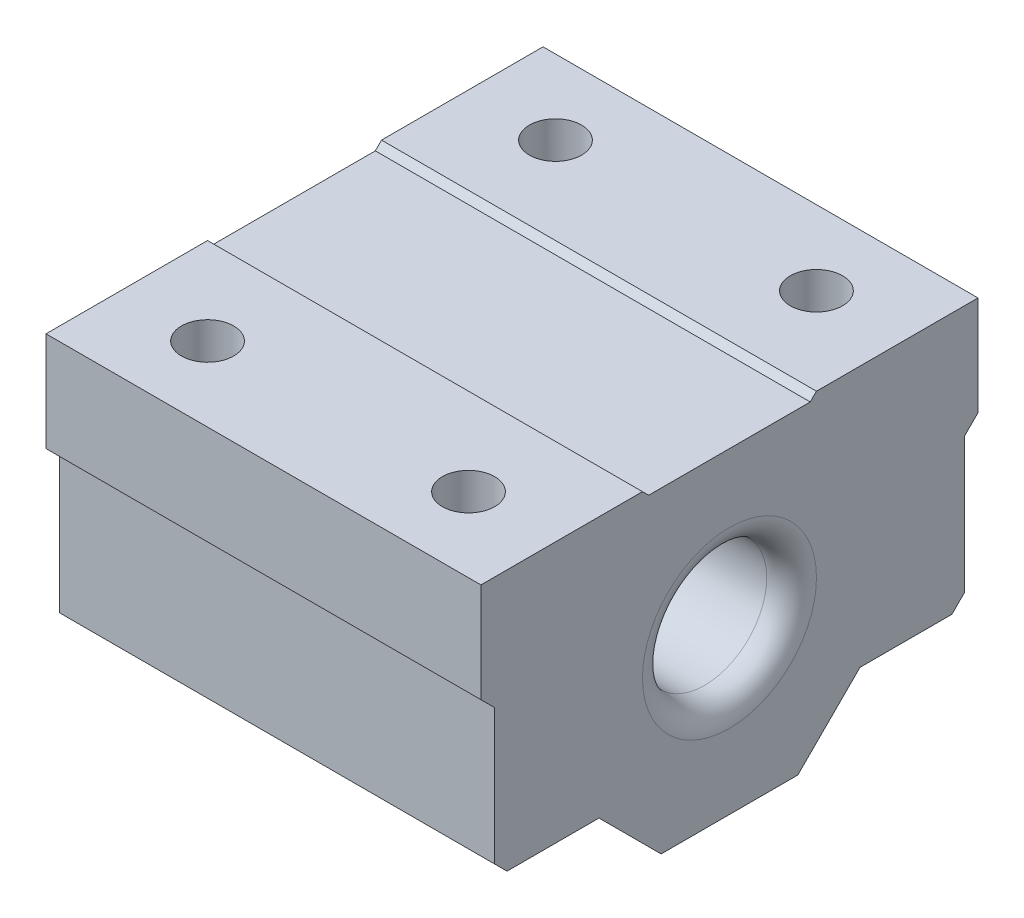
ISO-10303-21;
HEADER;
FILE_DESCRIPTION(('STEP AP214'),'2;1');
FILE_NAME('part.step','',(''),(''),'','','');
FILE_SCHEMA(('AUTOMOTIVE_DESIGN { 1 0 10303 214 1 1 1 1 }'));
ENDSEC;
DATA;
#1=APPLICATION_CONTEXT('core data for automotive mechanical design processes');
#2=APPLICATION_PROTOCOL_DEFINITION('international standard','automotive_design',2000,#1);
#3=PRODUCT_CONTEXT('',#1,'mechanical');
#4=PRODUCT('Part','Part','',(#3));
#5=PRODUCT_RELATED_PRODUCT_CATEGORY('part','',(#4));
#6=PRODUCT_DEFINITION_FORMATION('','',#4);
#7=PRODUCT_DEFINITION_CONTEXT('part definition',#1,'design');
#8=PRODUCT_DEFINITION('design','',#6,#7);
#9=PRODUCT_DEFINITION_SHAPE('','',#8);
#10=(LENGTH_UNIT() NAMED_UNIT(*) SI_UNIT(.MILLI.,.METRE.));
#11=(NAMED_UNIT(*) PLANE_ANGLE_UNIT() SI_UNIT($,.RADIAN.));
#12=(NAMED_UNIT(*) SI_UNIT($,.STERADIAN.) SOLID_ANGLE_UNIT());
#13=UNCERTAINTY_MEASURE_WITH_UNIT(LENGTH_MEASURE(1.E-05),#10,'distance_accuracy_value','');
#14=(GEOMETRIC_REPRESENTATION_CONTEXT(3) GLOBAL_UNCERTAINTY_ASSIGNED_CONTEXT((#13)) GLOBAL_UNIT_ASSIGNED_CONTEXT((#10,
#11,#12)) REPRESENTATION_CONTEXT('',''));
#15=CARTESIAN_POINT('',(0.,0.,0.));
#16=DIRECTION('',(0.,0.,1.));
#17=DIRECTION('',(1.,0.,0.));
#18=AXIS2_PLACEMENT_3D('',#15,#16,#17);
#19=CARTESIAN_POINT('',(2.,13.,-20.));
#20=DIRECTION('',(1.,0.,0.));
#21=DIRECTION('',(0.,0.,-1.));
#22=AXIS2_PLACEMENT_3D('',#19,#20,#21);
#23=TOROIDAL_SURFACE('',#22,7.,2.);
#24=CARTESIAN_POINT('',(0.,13.,-20.));
#25=DIRECTION('',(-1.,0.,0.));
#26=DIRECTION('',(0.,0.,-1.));
#27=AXIS2_PLACEMENT_3D('',#24,#25,#26);
#28=CIRCLE('',#27,7.);
#29=CARTESIAN_POINT('',(0.,13.,-27.));
#30=VERTEX_POINT('',#29);
#31=CARTESIAN_POINT('',(0.,13.,-13.));
#32=VERTEX_POINT('',#31);
#33=EDGE_CURVE('E156',#30,#32,#28,.T.);
#34=ORIENTED_EDGE('',*,*,#33,.T.);
#35=CARTESIAN_POINT('',(0.,13.,-20.));
#36=DIRECTION('',(-1.,0.,0.));
#37=DIRECTION('',(0.,0.,1.));
#38=AXIS2_PLACEMENT_3D('',#35,#36,#37);
#39=CIRCLE('',#38,7.);
#40=EDGE_CURVE('E153',#32,#30,#39,.T.);
#41=ORIENTED_EDGE('',*,*,#40,.T.);
#42=EDGE_LOOP('',(#34,#41));
#43=FACE_BOUND('',#42,.T.);
#44=CARTESIAN_POINT('',(2.,13.,-20.));
#45=DIRECTION('',(-1.,0.,0.));
#46=DIRECTION('',(0.,0.,1.));
#47=AXIS2_PLACEMENT_3D('',#44,#45,#46);
#48=CIRCLE('',#47,5.);
#49=CARTESIAN_POINT('',(2.,13.,-15.));
#50=VERTEX_POINT('',#49);
#51=EDGE_CURVE('E438',#50,#50,#48,.F.);
#52=ORIENTED_EDGE('',*,*,#51,.T.);
#53=EDGE_LOOP('',(#52));
#54=FACE_BOUND('',#53,.T.);
#55=ADVANCED_FACE('F17',(#43,#54),#23,.T.);
#56=CARTESIAN_POINT('',(35.,13.,-20.));
#57=DIRECTION('',(-1.,0.,0.));
#58=DIRECTION('',(0.,0.,1.));
#59=AXIS2_PLACEMENT_3D('',#56,#57,#58);
#60=CYLINDRICAL_SURFACE('',#59,5.);
#61=CARTESIAN_POINT('',(33.,13.,-20.));
#62=DIRECTION('',(1.,0.,0.));
#63=DIRECTION('',(0.,0.,-1.));
#64=AXIS2_PLACEMENT_3D('',#61,#62,#63);
#65=CIRCLE('',#64,5.);
#66=CARTESIAN_POINT('',(33.,13.,-25.));
#67=VERTEX_POINT('',#66);
#68=EDGE_CURVE('E423',#67,#67,#65,.F.);
#69=ORIENTED_EDGE('',*,*,#68,.F.);
#70=EDGE_LOOP('',(#69));
#71=FACE_BOUND('',#70,.T.);
#72=ORIENTED_EDGE('',*,*,#51,.F.);
#73=EDGE_LOOP('',(#72));
#74=FACE_BOUND('',#73,.T.);
#75=ADVANCED_FACE('F242',(#71,#74),#60,.F.);
#76=CARTESIAN_POINT('',(28.,26.,-6.00000000000001));
#77=DIRECTION('',(0.,1.,0.));
#78=DIRECTION('',(0.,0.,1.));
#79=AXIS2_PLACEMENT_3D('',#76,#77,#78);
#80=CYLINDRICAL_SURFACE('',#79,2.1);
#81=CARTESIAN_POINT('',(28.,5.99999999997181,-6.00000000000001));
#82=DIRECTION('',(0.,-1.,0.));
#83=DIRECTION('',(0.,0.,-1.));
#84=AXIS2_PLACEMENT_3D('',#81,#82,#83);
#85=CIRCLE('',#84,2.10000000001309);
#86=CARTESIAN_POINT('',(28.,5.99999999997181,-8.1000000000131));
#87=VERTEX_POINT('',#86);
#88=EDGE_CURVE('E445',#87,#87,#85,.T.);
#89=ORIENTED_EDGE('',*,*,#88,.T.);
#90=EDGE_LOOP('',(#89));
#91=FACE_BOUND('',#90,.T.);
#92=CARTESIAN_POINT('',(28.,26.,-6.00000000000001));
#93=DIRECTION('',(0.,1.,0.));
#94=DIRECTION('',(0.,0.,1.));
#95=AXIS2_PLACEMENT_3D('',#92,#93,#94);
#96=CIRCLE('',#95,2.1);
#97=CARTESIAN_POINT('',(28.,26.,-3.90000000000001));
#98=VERTEX_POINT('',#97);
#99=EDGE_CURVE('E413',#98,#98,#96,.T.);
#100=ORIENTED_EDGE('',*,*,#99,.T.);
#101=EDGE_LOOP('',(#100));
#102=FACE_BOUND('',#101,.T.);
#103=ADVANCED_FACE('F239',(#91,#102),#80,.F.);
#104=CARTESIAN_POINT('',(7.,26.,-6.));
#105=DIRECTION('',(0.,1.,0.));
#106=DIRECTION('',(0.,0.,1.));
#107=AXIS2_PLACEMENT_3D('',#104,#105,#106);
#108=CYLINDRICAL_SURFACE('',#107,2.1);
#109=CARTESIAN_POINT('',(7.,6.00000000002865,-6.));
#110=DIRECTION('',(0.,-1.,0.));
#111=DIRECTION('',(0.,0.,-1.));
#112=AXIS2_PLACEMENT_3D('',#109,#110,#111);
#113=CIRCLE('',#112,2.10000000001309);
#114=CARTESIAN_POINT('',(7.,6.00000000002865,-8.1000000000131));
#115=VERTEX_POINT('',#114);
#116=EDGE_CURVE('E442',#115,#115,#113,.T.);
#117=ORIENTED_EDGE('',*,*,#116,.T.);
#118=EDGE_LOOP('',(#117));
#119=FACE_BOUND('',#118,.T.);
#120=CARTESIAN_POINT('',(7.,26.,-6.));
#121=DIRECTION('',(0.,1.,0.));
#122=DIRECTION('',(0.,0.,1.));
#123=AXIS2_PLACEMENT_3D('',#120,#121,#122);
#124=CIRCLE('',#123,2.1);
#125=CARTESIAN_POINT('',(7.,26.,-3.90000000000001));
#126=VERTEX_POINT('',#125);
#127=EDGE_CURVE('E398',#126,#126,#124,.T.);
#128=ORIENTED_EDGE('',*,*,#127,.T.);
#129=EDGE_LOOP('',(#128));
#130=FACE_BOUND('',#129,.T.);
#131=ADVANCED_FACE('F235',(#119,#130),#108,.F.);
#132=CARTESIAN_POINT('',(35.,18.,0.));
#133=DIRECTION('',(0.,0.707106781186549,-0.707106781186546));
#134=DIRECTION('',(0.,0.707106781186546,0.707106781186549));
#135=AXIS2_PLACEMENT_3D('',#132,#133,#134);
#136=PLANE('',#135);
#137=DIRECTION('',(1.,0.,0.));
#138=VECTOR('',#137,1.);
#139=CARTESIAN_POINT('',(35.,16.9,-1.1));
#140=LINE('',#139,#138);
#141=CARTESIAN_POINT('',(0.,16.9,-1.1));
#142=VERTEX_POINT('',#141);
#143=CARTESIAN_POINT('',(35.,16.9,-1.1));
#144=VERTEX_POINT('',#143);
#145=EDGE_CURVE('E384',#142,#144,#140,.T.);
#146=ORIENTED_EDGE('',*,*,#145,.T.);
#147=DIRECTION('',(0.,0.707106781186546,0.707106781186549));
#148=VECTOR('',#147,1.);
#149=CARTESIAN_POINT('',(35.,18.,0.));
#150=LINE('',#149,#148);
#151=CARTESIAN_POINT('',(35.,18.,0.));
#152=VERTEX_POINT('',#151);
#153=EDGE_CURVE('E441',#152,#144,#150,.F.);
#154=ORIENTED_EDGE('',*,*,#153,.F.);
#155=DIRECTION('',(-1.,0.,0.));
#156=VECTOR('',#155,1.);
#157=CARTESIAN_POINT('',(35.,18.,0.));
#158=LINE('',#157,#156);
#159=CARTESIAN_POINT('',(0.,18.,0.));
#160=VERTEX_POINT('',#159);
#161=EDGE_CURVE('E390',#152,#160,#158,.T.);
#162=ORIENTED_EDGE('',*,*,#161,.T.);
#163=DIRECTION('',(0.,-0.707106781186548,-0.707106781186547));
#164=VECTOR('',#163,1.);
#165=CARTESIAN_POINT('',(0.,18.,0.));
#166=LINE('',#165,#164);
#167=EDGE_CURVE('E163',#160,#142,#166,.T.);
#168=ORIENTED_EDGE('',*,*,#167,.T.);
#169=EDGE_LOOP('',(#146,#154,#162,#168));
#170=FACE_BOUND('',#169,.T.);
#171=ADVANCED_FACE('F231',(#170),#136,.F.);
#172=CARTESIAN_POINT('',(7.,4.99999999999545,-6.));
#173=DIRECTION('',(0.,-1.,0.));
#174=DIRECTION('',(0.,0.,-1.));
#175=AXIS2_PLACEMENT_3D('',#172,#173,#174);
#176=CONICAL_SURFACE('',#175,3.09999999998945,0.785398163369027);
#177=CARTESIAN_POINT('',(7.,4.99999999999545,-6.));
#178=DIRECTION('',(0.,-1.,0.));
#179=DIRECTION('',(0.,0.,-1.));
#180=AXIS2_PLACEMENT_3D('',#177,#178,#179);
#181=CIRCLE('',#180,3.09999999998945);
#182=CARTESIAN_POINT('',(7.,4.99999999999545,-9.09999999998945));
#183=VERTEX_POINT('',#182);
#184=EDGE_CURVE('E381',#183,#183,#181,.T.);
#185=ORIENTED_EDGE('',*,*,#184,.T.);
#186=EDGE_LOOP('',(#185));
#187=FACE_BOUND('',#186,.T.);
#188=ORIENTED_EDGE('',*,*,#116,.F.);
#189=EDGE_LOOP('',(#188));
#190=FACE_BOUND('',#189,.T.);
#191=ADVANCED_FACE('F227',(#187,#190),#176,.F.);
#192=CARTESIAN_POINT('',(28.,4.99999999999545,-6.00000000000001));
#193=DIRECTION('',(0.,-1.,0.));
#194=DIRECTION('',(0.,0.,-1.));
#195=AXIS2_PLACEMENT_3D('',#192,#193,#194);
#196=CONICAL_SURFACE('',#195,3.10000000004629,0.78539816342587);
#197=CARTESIAN_POINT('',(28.,4.99999999996725,-6.00000000000001));
#198=DIRECTION('',(0.,-1.,0.));
#199=DIRECTION('',(0.,0.,-1.));
#200=AXIS2_PLACEMENT_3D('',#197,#198,#199);
#201=CIRCLE('',#200,3.10000000007449);
#202=CARTESIAN_POINT('',(28.,4.99999999996725,-9.10000000007449));
#203=VERTEX_POINT('',#202);
#204=EDGE_CURVE('E377',#203,#203,#201,.T.);
#205=ORIENTED_EDGE('',*,*,#204,.T.);
#206=EDGE_LOOP('',(#205));
#207=FACE_BOUND('',#206,.T.);
#208=ORIENTED_EDGE('',*,*,#88,.F.);
#209=EDGE_LOOP('',(#208));
#210=FACE_BOUND('',#209,.T.);
#211=ADVANCED_FACE('F223',(#207,#210),#196,.F.);
#212=CARTESIAN_POINT('',(35.,6.,-1.1));
#213=DIRECTION('',(0.,0.707106781186547,-0.707106781186548));
#214=DIRECTION('',(0.,0.707106781186548,0.707106781186547));
#215=AXIS2_PLACEMENT_3D('',#212,#213,#214);
#216=PLANE('',#215);
#217=DIRECTION('',(1.,0.,0.));
#218=VECTOR('',#217,1.);
#219=CARTESIAN_POINT('',(35.,5.,-2.1));
#220=LINE('',#219,#218);
#221=CARTESIAN_POINT('',(0.,5.,-2.1));
#222=VERTEX_POINT('',#221);
#223=CARTESIAN_POINT('',(35.,5.,-2.1));
#224=VERTEX_POINT('',#223);
#225=EDGE_CURVE('E374',#222,#224,#220,.T.);
#226=ORIENTED_EDGE('',*,*,#225,.T.);
#227=DIRECTION('',(0.,0.707106781186548,0.707106781186547));
#228=VECTOR('',#227,1.);
#229=CARTESIAN_POINT('',(35.,6.,-1.1));
#230=LINE('',#229,#228);
#231=CARTESIAN_POINT('',(35.,6.,-1.1));
#232=VERTEX_POINT('',#231);
#233=EDGE_CURVE('E448',#232,#224,#230,.F.);
#234=ORIENTED_EDGE('',*,*,#233,.F.);
#235=DIRECTION('',(1.,0.,0.));
#236=VECTOR('',#235,1.);
#237=CARTESIAN_POINT('',(35.,6.,-1.1));
#238=LINE('',#237,#236);
#239=CARTESIAN_POINT('',(0.,6.,-1.1));
#240=VERTEX_POINT('',#239);
#241=EDGE_CURVE('E382',#232,#240,#238,.F.);
#242=ORIENTED_EDGE('',*,*,#241,.T.);
#243=DIRECTION('',(0.,-0.707106781186548,-0.707106781186547));
#244=VECTOR('',#243,1.);
#245=CARTESIAN_POINT('',(0.,6.,-1.1));
#246=LINE('',#245,#244);
#247=EDGE_CURVE('E476',#240,#222,#246,.T.);
#248=ORIENTED_EDGE('',*,*,#247,.T.);
#249=EDGE_LOOP('',(#226,#234,#242,#248));
#250=FACE_BOUND('',#249,.T.);
#251=ADVANCED_FACE('F219',(#250),#216,.F.);
#252=CARTESIAN_POINT('',(28.,4.99999999999545,-34.));
#253=DIRECTION('',(0.,-1.,0.));
#254=DIRECTION('',(0.,0.,-1.));
#255=AXIS2_PLACEMENT_3D('',#252,#253,#254);
#256=CONICAL_SURFACE('',#255,3.10000000000946,0.78539816342587);
#257=CARTESIAN_POINT('',(28.,4.99999999998726,-34.));
#258=DIRECTION('',(0.,-1.,0.));
#259=DIRECTION('',(0.,0.,-1.));
#260=AXIS2_PLACEMENT_3D('',#257,#258,#259);
#261=CIRCLE('',#260,3.10000000001764);
#262=CARTESIAN_POINT('',(28.,4.99999999998726,-37.1000000000176));
#263=VERTEX_POINT('',#262);
#264=EDGE_CURVE('E358',#263,#263,#261,.T.);
#265=ORIENTED_EDGE('',*,*,#264,.T.);
#266=EDGE_LOOP('',(#265));
#267=FACE_BOUND('',#266,.T.);
#268=CARTESIAN_POINT('',(28.,6.,-34.));
#269=DIRECTION('',(0.,1.,0.));
#270=DIRECTION('',(0.,0.,1.));
#271=AXIS2_PLACEMENT_3D('',#268,#269,#270);
#272=CIRCLE('',#271,2.1);
#273=CARTESIAN_POINT('',(28.,6.,-31.9));
#274=VERTEX_POINT('',#273);
#275=EDGE_CURVE('E452',#274,#274,#272,.T.);
#276=ORIENTED_EDGE('',*,*,#275,.T.);
#277=EDGE_LOOP('',(#276));
#278=FACE_BOUND('',#277,.T.);
#279=ADVANCED_FACE('F215',(#267,#278),#256,.F.);
#280=CARTESIAN_POINT('',(7.,5.0000000000523,-34.));
#281=DIRECTION('',(0.,-1.,0.));
#282=DIRECTION('',(0.,0.,-1.));
#283=AXIS2_PLACEMENT_3D('',#280,#281,#282);
#284=CONICAL_SURFACE('',#283,3.09999999989577,0.785398163397448);
#285=CARTESIAN_POINT('',(7.,4.99999999999545,-34.));
#286=DIRECTION('',(0.,-1.,0.));
#287=DIRECTION('',(0.,0.,-1.));
#288=AXIS2_PLACEMENT_3D('',#285,#286,#287);
#289=CIRCLE('',#288,3.09999999995261);
#290=CARTESIAN_POINT('',(7.,4.99999999999545,-37.0999999999526));
#291=VERTEX_POINT('',#290);
#292=EDGE_CURVE('E354',#291,#291,#289,.T.);
#293=ORIENTED_EDGE('',*,*,#292,.T.);
#294=EDGE_LOOP('',(#293));
#295=FACE_BOUND('',#294,.T.);
#296=CARTESIAN_POINT('',(7.,6.00000000000001,-34.));
#297=DIRECTION('',(0.,1.,0.));
#298=DIRECTION('',(0.,0.,1.));
#299=AXIS2_PLACEMENT_3D('',#296,#297,#298);
#300=CIRCLE('',#299,2.1);
#301=CARTESIAN_POINT('',(7.,6.00000000000001,-31.9));
#302=VERTEX_POINT('',#301);
#303=EDGE_CURVE('E449',#302,#302,#300,.T.);
#304=ORIENTED_EDGE('',*,*,#303,.T.);
#305=EDGE_LOOP('',(#304));
#306=FACE_BOUND('',#305,.T.);
#307=ADVANCED_FACE('F211',(#295,#306),#284,.F.);
#308=CARTESIAN_POINT('',(35.,6.,-38.9));
#309=DIRECTION('',(0.,0.707106781186548,0.707106781186547));
#310=DIRECTION('',(0.,-0.707106781186547,0.707106781186548));
#311=AXIS2_PLACEMENT_3D('',#308,#309,#310);
#312=PLANE('',#311);
#313=DIRECTION('',(1.,0.,0.));
#314=VECTOR('',#313,1.);
#315=CARTESIAN_POINT('',(35.,6.,-38.9));
#316=LINE('',#315,#314);
#317=CARTESIAN_POINT('',(0.,6.,-38.9));
#318=VERTEX_POINT('',#317);
#319=CARTESIAN_POINT('',(35.,6.,-38.9));
#320=VERTEX_POINT('',#319);
#321=EDGE_CURVE('E344',#318,#320,#316,.T.);
#322=ORIENTED_EDGE('',*,*,#321,.T.);
#323=DIRECTION('',(0.,-0.707106781186547,0.707106781186548));
#324=VECTOR('',#323,1.);
#325=CARTESIAN_POINT('',(35.,6.,-38.9));
#326=LINE('',#325,#324);
#327=CARTESIAN_POINT('',(35.,5.,-37.9));
#328=VERTEX_POINT('',#327);
#329=EDGE_CURVE('E470',#328,#320,#326,.F.);
#330=ORIENTED_EDGE('',*,*,#329,.F.);
#331=DIRECTION('',(1.,0.,0.));
#332=VECTOR('',#331,1.);
#333=CARTESIAN_POINT('',(35.,5.,-37.9));
#334=LINE('',#333,#332);
#335=CARTESIAN_POINT('',(0.,5.,-37.9));
#336=VERTEX_POINT('',#335);
#337=EDGE_CURVE('E350',#328,#336,#334,.F.);
#338=ORIENTED_EDGE('',*,*,#337,.T.);
#339=DIRECTION('',(0.,0.707106781186547,-0.707106781186548));
#340=VECTOR('',#339,1.);
#341=CARTESIAN_POINT('',(0.,5.,-37.9));
#342=LINE('',#341,#340);
#343=EDGE_CURVE('E478',#336,#318,#342,.T.);
#344=ORIENTED_EDGE('',*,*,#343,.T.);
#345=EDGE_LOOP('',(#322,#330,#338,#344));
#346=FACE_BOUND('',#345,.T.);
#347=ADVANCED_FACE('F207',(#346),#312,.F.);
#348=CARTESIAN_POINT('',(35.,18.,-40.));
#349=DIRECTION('',(0.,0.70710678118655,0.707106781186545));
#350=DIRECTION('',(0.,-0.707106781186545,0.70710678118655));
#351=AXIS2_PLACEMENT_3D('',#348,#349,#350);
#352=PLANE('',#351);
#353=DIRECTION('',(1.,0.,0.));
#354=VECTOR('',#353,1.);
#355=CARTESIAN_POINT('',(35.,18.,-40.));
#356=LINE('',#355,#354);
#357=CARTESIAN_POINT('',(0.,18.,-40.));
#358=VERTEX_POINT('',#357);
#359=CARTESIAN_POINT('',(35.,18.,-40.));
#360=VERTEX_POINT('',#359);
#361=EDGE_CURVE('E336',#358,#360,#356,.T.);
#362=ORIENTED_EDGE('',*,*,#361,.T.);
#363=DIRECTION('',(0.,-0.707106781186545,0.70710678118655));
#364=VECTOR('',#363,1.);
#365=CARTESIAN_POINT('',(35.,18.,-40.));
#366=LINE('',#365,#364);
#367=CARTESIAN_POINT('',(35.,16.9,-38.9));
#368=VERTEX_POINT('',#367);
#369=EDGE_CURVE('E453',#368,#360,#366,.F.);
#370=ORIENTED_EDGE('',*,*,#369,.F.);
#371=DIRECTION('',(1.,0.,0.));
#372=VECTOR('',#371,1.);
#373=CARTESIAN_POINT('',(35.,16.9,-38.9));
#374=LINE('',#373,#372);
#375=CARTESIAN_POINT('',(0.,16.9,-38.9));
#376=VERTEX_POINT('',#375);
#377=EDGE_CURVE('E342',#368,#376,#374,.F.);
#378=ORIENTED_EDGE('',*,*,#377,.T.);
#379=DIRECTION('',(0.,0.707106781186546,-0.707106781186549));
#380=VECTOR('',#379,1.);
#381=CARTESIAN_POINT('',(0.,16.9,-38.9));
#382=LINE('',#381,#380);
#383=EDGE_CURVE('E480',#376,#358,#382,.T.);
#384=ORIENTED_EDGE('',*,*,#383,.T.);
#385=EDGE_LOOP('',(#362,#370,#378,#384));
#386=FACE_BOUND('',#385,.T.);
#387=ADVANCED_FACE('F203',(#386),#352,.F.);
#388=CARTESIAN_POINT('',(7.,26.,-34.));
#389=DIRECTION('',(0.,1.,0.));
#390=DIRECTION('',(0.,0.,1.));
#391=AXIS2_PLACEMENT_3D('',#388,#389,#390);
#392=CYLINDRICAL_SURFACE('',#391,2.1);
#393=ORIENTED_EDGE('',*,*,#303,.F.);
#394=EDGE_LOOP('',(#393));
#395=FACE_BOUND('',#394,.T.);
#396=CARTESIAN_POINT('',(7.,26.,-34.));
#397=DIRECTION('',(0.,1.,0.));
#398=DIRECTION('',(0.,0.,1.));
#399=AXIS2_PLACEMENT_3D('',#396,#397,#398);
#400=CIRCLE('',#399,2.1);
#401=CARTESIAN_POINT('',(7.,26.,-31.9));
#402=VERTEX_POINT('',#401);
#403=EDGE_CURVE('E335',#402,#402,#400,.T.);
#404=ORIENTED_EDGE('',*,*,#403,.T.);
#405=EDGE_LOOP('',(#404));
#406=FACE_BOUND('',#405,.T.);
#407=ADVANCED_FACE('F199',(#395,#406),#392,.F.);
#408=CARTESIAN_POINT('',(28.,26.,-34.));
#409=DIRECTION('',(0.,1.,0.));
#410=DIRECTION('',(0.,0.,1.));
#411=AXIS2_PLACEMENT_3D('',#408,#409,#410);
#412=CYLINDRICAL_SURFACE('',#411,2.1);
#413=ORIENTED_EDGE('',*,*,#275,.F.);
#414=EDGE_LOOP('',(#413));
#415=FACE_BOUND('',#414,.T.);
#416=CARTESIAN_POINT('',(28.,26.,-34.));
#417=DIRECTION('',(0.,1.,0.));
#418=DIRECTION('',(0.,0.,1.));
#419=AXIS2_PLACEMENT_3D('',#416,#417,#418);
#420=CIRCLE('',#419,2.1);
#421=CARTESIAN_POINT('',(28.,26.,-31.9));
#422=VERTEX_POINT('',#421);
#423=EDGE_CURVE('E331',#422,#422,#420,.T.);
#424=ORIENTED_EDGE('',*,*,#423,.T.);
#425=EDGE_LOOP('',(#424));
#426=FACE_BOUND('',#425,.T.);
#427=ADVANCED_FACE('F195',(#415,#426),#412,.F.);
#428=CARTESIAN_POINT('',(35.,26.,-27.));
#429=DIRECTION('',(0.,-0.707106781186548,-0.707106781186548));
#430=DIRECTION('',(0.,0.707106781186548,-0.707106781186548));
#431=AXIS2_PLACEMENT_3D('',#428,#429,#430);
#432=PLANE('',#431);
#433=DIRECTION('',(1.,0.,0.));
#434=VECTOR('',#433,1.);
#435=CARTESIAN_POINT('',(35.,25.5,-26.5));
#436=LINE('',#435,#434);
#437=CARTESIAN_POINT('',(0.,25.5,-26.5));
#438=VERTEX_POINT('',#437);
#439=CARTESIAN_POINT('',(35.,25.5,-26.5));
#440=VERTEX_POINT('',#439);
#441=EDGE_CURVE('E321',#438,#440,#436,.T.);
#442=ORIENTED_EDGE('',*,*,#441,.T.);
#443=DIRECTION('',(0.,0.707106781186548,-0.707106781186548));
#444=VECTOR('',#443,1.);
#445=CARTESIAN_POINT('',(35.,26.,-27.));
#446=LINE('',#445,#444);
#447=CARTESIAN_POINT('',(35.,26.,-27.));
#448=VERTEX_POINT('',#447);
#449=EDGE_CURVE('E456',#448,#440,#446,.F.);
#450=ORIENTED_EDGE('',*,*,#449,.F.);
#451=DIRECTION('',(1.,0.,0.));
#452=VECTOR('',#451,1.);
#453=CARTESIAN_POINT('',(35.,26.,-27.));
#454=LINE('',#453,#452);
#455=CARTESIAN_POINT('',(0.,26.,-27.));
#456=VERTEX_POINT('',#455);
#457=EDGE_CURVE('E327',#448,#456,#454,.F.);
#458=ORIENTED_EDGE('',*,*,#457,.T.);
#459=DIRECTION('',(0.,-0.707106781186547,0.707106781186547));
#460=VECTOR('',#459,1.);
#461=CARTESIAN_POINT('',(0.,26.,-27.));
#462=LINE('',#461,#460);
#463=EDGE_CURVE('E481',#456,#438,#462,.T.);
#464=ORIENTED_EDGE('',*,*,#463,.T.);
#465=EDGE_LOOP('',(#442,#450,#458,#464));
#466=FACE_BOUND('',#465,.T.);
#467=ADVANCED_FACE('F192',(#466),#432,.F.);
#468=CARTESIAN_POINT('',(35.,26.,-13.));
#469=DIRECTION('',(0.,-0.707106781186545,0.70710678118655));
#470=DIRECTION('',(0.,-0.70710678118655,-0.707106781186545));
#471=AXIS2_PLACEMENT_3D('',#468,#469,#470);
#472=PLANE('',#471);
#473=DIRECTION('',(1.,0.,0.));
#474=VECTOR('',#473,1.);
#475=CARTESIAN_POINT('',(35.,26.,-13.));
#476=LINE('',#475,#474);
#477=CARTESIAN_POINT('',(0.,26.,-13.));
#478=VERTEX_POINT('',#477);
#479=CARTESIAN_POINT('',(35.,26.,-13.));
#480=VERTEX_POINT('',#479);
#481=EDGE_CURVE('E397',#478,#480,#476,.T.);
#482=ORIENTED_EDGE('',*,*,#481,.T.);
#483=DIRECTION('',(0.,-0.70710678118655,-0.707106781186545));
#484=VECTOR('',#483,1.);
#485=CARTESIAN_POINT('',(35.,26.,-13.));
#486=LINE('',#485,#484);
#487=CARTESIAN_POINT('',(35.,25.5,-13.5));
#488=VERTEX_POINT('',#487);
#489=EDGE_CURVE('E38',#488,#480,#486,.F.);
#490=ORIENTED_EDGE('',*,*,#489,.F.);
#491=DIRECTION('',(1.,0.,0.));
#492=VECTOR('',#491,1.);
#493=CARTESIAN_POINT('',(35.,25.5,-13.5));
#494=LINE('',#493,#492);
#495=CARTESIAN_POINT('',(0.,25.5,-13.5));
#496=VERTEX_POINT('',#495);
#497=EDGE_CURVE('E319',#488,#496,#494,.F.);
#498=ORIENTED_EDGE('',*,*,#497,.T.);
#499=DIRECTION('',(0.,0.707106781186551,0.707106781186544));
#500=VECTOR('',#499,1.);
#501=CARTESIAN_POINT('',(0.,25.5,-13.5));
#502=LINE('',#501,#500);
#503=EDGE_CURVE('E172',#496,#478,#502,.T.);
#504=ORIENTED_EDGE('',*,*,#503,.T.);
#505=EDGE_LOOP('',(#482,#490,#498,#504));
#506=FACE_BOUND('',#505,.T.);
#507=ADVANCED_FACE('F184',(#506),#472,.F.);
#508=CARTESIAN_POINT('',(0.,0.,0.));
#509=DIRECTION('',(1.,0.,0.));
#510=DIRECTION('',(0.,0.,-1.));
#511=AXIS2_PLACEMENT_3D('',#508,#509,#510);
#512=PLANE('',#511);
#513=ORIENTED_EDGE('',*,*,#503,.F.);
#514=DIRECTION('',(0.,0.,-1.));
#515=VECTOR('',#514,1.);
#516=CARTESIAN_POINT('',(0.,25.5,-13.5));
#517=LINE('',#516,#515);
#518=EDGE_CURVE('E315',#496,#438,#517,.T.);
#519=ORIENTED_EDGE('',*,*,#518,.T.);
#520=ORIENTED_EDGE('',*,*,#463,.F.);
#521=DIRECTION('',(0.,0.,-1.));
#522=VECTOR('',#521,1.);
#523=CARTESIAN_POINT('',(0.,26.,-27.));
#524=LINE('',#523,#522);
#525=CARTESIAN_POINT('',(0.,26.,-40.));
#526=VERTEX_POINT('',#525);
#527=EDGE_CURVE('E324',#456,#526,#524,.T.);
#528=ORIENTED_EDGE('',*,*,#527,.T.);
#529=DIRECTION('',(0.,1.,0.));
#530=VECTOR('',#529,1.);
#531=CARTESIAN_POINT('',(0.,18.,-40.));
#532=LINE('',#531,#530);
#533=EDGE_CURVE('E332',#526,#358,#532,.F.);
#534=ORIENTED_EDGE('',*,*,#533,.T.);
#535=ORIENTED_EDGE('',*,*,#383,.F.);
#536=DIRECTION('',(0.,-1.,0.));
#537=VECTOR('',#536,1.);
#538=CARTESIAN_POINT('',(0.,16.9,-38.9));
#539=LINE('',#538,#537);
#540=EDGE_CURVE('E339',#376,#318,#539,.T.);
#541=ORIENTED_EDGE('',*,*,#540,.T.);
#542=ORIENTED_EDGE('',*,*,#343,.F.);
#543=DIRECTION('',(0.,0.,1.));
#544=VECTOR('',#543,1.);
#545=CARTESIAN_POINT('',(0.,5.,-37.9));
#546=LINE('',#545,#544);
#547=CARTESIAN_POINT('',(0.,5.,-30.5));
#548=VERTEX_POINT('',#547);
#549=EDGE_CURVE('E347',#336,#548,#546,.T.);
#550=ORIENTED_EDGE('',*,*,#549,.T.);
#551=DIRECTION('',(0.,-0.707106781186549,0.707106781186546));
#552=VECTOR('',#551,1.);
#553=CARTESIAN_POINT('',(0.,5.,-30.5));
#554=LINE('',#553,#552);
#555=CARTESIAN_POINT('',(0.,0.,-25.5));
#556=VERTEX_POINT('',#555);
#557=EDGE_CURVE('E355',#548,#556,#554,.T.);
#558=ORIENTED_EDGE('',*,*,#557,.T.);
#559=DIRECTION('',(0.,0.,1.));
#560=VECTOR('',#559,1.);
#561=CARTESIAN_POINT('',(0.,0.,-14.5));
#562=LINE('',#561,#560);
#563=CARTESIAN_POINT('',(0.,0.,-14.5));
#564=VERTEX_POINT('',#563);
#565=EDGE_CURVE('E361',#556,#564,#562,.T.);
#566=ORIENTED_EDGE('',*,*,#565,.T.);
#567=DIRECTION('',(0.,0.707106781186549,0.707106781186546));
#568=VECTOR('',#567,1.);
#569=CARTESIAN_POINT('',(0.,4.99999999999999,-9.50000000000003));
#570=LINE('',#569,#568);
#571=CARTESIAN_POINT('',(0.,4.99999999999999,-9.50000000000003));
#572=VERTEX_POINT('',#571);
#573=EDGE_CURVE('E366',#564,#572,#570,.T.);
#574=ORIENTED_EDGE('',*,*,#573,.T.);
#575=DIRECTION('',(0.,0.,1.));
#576=VECTOR('',#575,1.);
#577=CARTESIAN_POINT('',(0.,5.,-2.1));
#578=LINE('',#577,#576);
#579=EDGE_CURVE('E371',#572,#222,#578,.T.);
#580=ORIENTED_EDGE('',*,*,#579,.T.);
#581=ORIENTED_EDGE('',*,*,#247,.F.);
#582=DIRECTION('',(0.,1.,0.));
#583=VECTOR('',#582,1.);
#584=CARTESIAN_POINT('',(0.,16.9,-1.1));
#585=LINE('',#584,#583);
#586=EDGE_CURVE('E378',#240,#142,#585,.T.);
#587=ORIENTED_EDGE('',*,*,#586,.T.);
#588=ORIENTED_EDGE('',*,*,#167,.F.);
#589=DIRECTION('',(0.,1.,0.));
#590=VECTOR('',#589,1.);
#591=CARTESIAN_POINT('',(0.,18.,0.));
#592=LINE('',#591,#590);
#593=CARTESIAN_POINT('',(0.,26.,0.));
#594=VERTEX_POINT('',#593);
#595=EDGE_CURVE('E387',#160,#594,#592,.T.);
#596=ORIENTED_EDGE('',*,*,#595,.T.);
#597=DIRECTION('',(0.,0.,-1.));
#598=VECTOR('',#597,1.);
#599=CARTESIAN_POINT('',(0.,26.,0.));
#600=LINE('',#599,#598);
#601=EDGE_CURVE('E394',#594,#478,#600,.T.);
#602=ORIENTED_EDGE('',*,*,#601,.T.);
#603=EDGE_LOOP('',(#513,#519,#520,#528,#534,#535,#541,#542,#550,#558,#566,#574,#580,#581,#587,
#588,#596,#602));
#604=FACE_BOUND('',#603,.T.);
#605=ORIENTED_EDGE('',*,*,#33,.F.);
#606=ORIENTED_EDGE('',*,*,#40,.F.);
#607=EDGE_LOOP('',(#605,#606));
#608=FACE_BOUND('',#607,.T.);
#609=ADVANCED_FACE('F162',(#604,#608),#512,.F.);
#610=CARTESIAN_POINT('',(33.,13.,-20.));
#611=DIRECTION('',(1.,0.,0.));
#612=DIRECTION('',(0.,0.,-1.));
#613=AXIS2_PLACEMENT_3D('',#610,#611,#612);
#614=TOROIDAL_SURFACE('',#613,7.,2.);
#615=ORIENTED_EDGE('',*,*,#68,.T.);
#616=EDGE_LOOP('',(#615));
#617=FACE_BOUND('',#616,.T.);
#618=CARTESIAN_POINT('',(35.,13.,-20.));
#619=DIRECTION('',(1.,0.,0.));
#620=DIRECTION('',(0.,0.,-1.));
#621=AXIS2_PLACEMENT_3D('',#618,#619,#620);
#622=CIRCLE('',#621,7.);
#623=CARTESIAN_POINT('',(35.,13.,-13.));
#624=VERTEX_POINT('',#623);
#625=CARTESIAN_POINT('',(35.,13.,-27.));
#626=VERTEX_POINT('',#625);
#627=EDGE_CURVE('E314',#624,#626,#622,.F.);
#628=ORIENTED_EDGE('',*,*,#627,.F.);
#629=CARTESIAN_POINT('',(35.,13.,-20.));
#630=DIRECTION('',(1.,0.,0.));
#631=DIRECTION('',(0.,0.,1.));
#632=AXIS2_PLACEMENT_3D('',#629,#630,#631);
#633=CIRCLE('',#632,7.);
#634=EDGE_CURVE('E318',#626,#624,#633,.F.);
#635=ORIENTED_EDGE('',*,*,#634,.F.);
#636=EDGE_LOOP('',(#628,#635));
#637=FACE_BOUND('',#636,.T.);
#638=ADVANCED_FACE('F183',(#617,#637),#614,.T.);
#639=CARTESIAN_POINT('',(35.,26.,0.));
#640=DIRECTION('',(0.,-1.,0.));
#641=DIRECTION('',(0.,0.,-1.));
#642=AXIS2_PLACEMENT_3D('',#639,#640,#641);
#643=PLANE('',#642);
#644=DIRECTION('',(-1.,0.,0.));
#645=VECTOR('',#644,1.);
#646=CARTESIAN_POINT('',(35.,26.,0.));
#647=LINE('',#646,#645);
#648=CARTESIAN_POINT('',(35.,26.,0.));
#649=VERTEX_POINT('',#648);
#650=EDGE_CURVE('E392',#594,#649,#647,.F.);
#651=ORIENTED_EDGE('',*,*,#650,.T.);
#652=DIRECTION('',(0.,0.,-1.));
#653=VECTOR('',#652,1.);
#654=CARTESIAN_POINT('',(35.,26.,0.));
#655=LINE('',#654,#653);
#656=EDGE_CURVE('E311',#480,#649,#655,.F.);
#657=ORIENTED_EDGE('',*,*,#656,.F.);
#658=ORIENTED_EDGE('',*,*,#481,.F.);
#659=ORIENTED_EDGE('',*,*,#601,.F.);
#660=EDGE_LOOP('',(#651,#657,#658,#659));
#661=FACE_BOUND('',#660,.T.);
#662=ORIENTED_EDGE('',*,*,#127,.F.);
#663=EDGE_LOOP('',(#662));
#664=FACE_BOUND('',#663,.T.);
#665=ORIENTED_EDGE('',*,*,#99,.F.);
#666=EDGE_LOOP('',(#665));
#667=FACE_BOUND('',#666,.T.);
#668=ADVANCED_FACE('F491',(#661,#664,#667),#643,.F.);
#669=CARTESIAN_POINT('',(35.,18.,0.));
#670=DIRECTION('',(0.,0.,-1.));
#671=DIRECTION('',(-1.,0.,0.));
#672=AXIS2_PLACEMENT_3D('',#669,#670,#671);
#673=PLANE('',#672);
#674=ORIENTED_EDGE('',*,*,#161,.F.);
#675=DIRECTION('',(0.,1.,0.));
#676=VECTOR('',#675,1.);
#677=CARTESIAN_POINT('',(35.,0.,0.));
#678=LINE('',#677,#676);
#679=EDGE_CURVE('E308',#649,#152,#678,.F.);
#680=ORIENTED_EDGE('',*,*,#679,.F.);
#681=ORIENTED_EDGE('',*,*,#650,.F.);
#682=ORIENTED_EDGE('',*,*,#595,.F.);
#683=EDGE_LOOP('',(#674,#680,#681,#682));
#684=FACE_BOUND('',#683,.T.);
#685=ADVANCED_FACE('F547',(#684),#673,.F.);
#686=CARTESIAN_POINT('',(35.,16.9,-1.1));
#687=DIRECTION('',(0.,0.,-1.));
#688=DIRECTION('',(0.,1.,0.));
#689=AXIS2_PLACEMENT_3D('',#686,#687,#688);
#690=PLANE('',#689);
#691=ORIENTED_EDGE('',*,*,#241,.F.);
#692=DIRECTION('',(0.,1.,0.));
#693=VECTOR('',#692,1.);
#694=CARTESIAN_POINT('',(35.,0.,-1.1));
#695=LINE('',#694,#693);
#696=EDGE_CURVE('E305',#144,#232,#695,.F.);
#697=ORIENTED_EDGE('',*,*,#696,.F.);
#698=ORIENTED_EDGE('',*,*,#145,.F.);
#699=ORIENTED_EDGE('',*,*,#586,.F.);
#700=EDGE_LOOP('',(#691,#697,#698,#699));
#701=FACE_BOUND('',#700,.T.);
#702=ADVANCED_FACE('F543',(#701),#690,.F.);
#703=CARTESIAN_POINT('',(35.,5.,-2.1));
#704=DIRECTION('',(0.,1.,0.));
#705=DIRECTION('',(0.,0.,1.));
#706=AXIS2_PLACEMENT_3D('',#703,#704,#705);
#707=PLANE('',#706);
#708=DIRECTION('',(1.,0.,0.));
#709=VECTOR('',#708,1.);
#710=CARTESIAN_POINT('',(35.,4.99999999999999,-9.50000000000003));
#711=LINE('',#710,#709);
#712=CARTESIAN_POINT('',(35.,4.99999999999999,-9.50000000000003));
#713=VERTEX_POINT('',#712);
#714=EDGE_CURVE('E369',#572,#713,#711,.T.);
#715=ORIENTED_EDGE('',*,*,#714,.T.);
#716=DIRECTION('',(0.,0.,-1.));
#717=VECTOR('',#716,1.);
#718=CARTESIAN_POINT('',(35.,5.,0.));
#719=LINE('',#718,#717);
#720=EDGE_CURVE('E302',#224,#713,#719,.T.);
#721=ORIENTED_EDGE('',*,*,#720,.F.);
#722=ORIENTED_EDGE('',*,*,#225,.F.);
#723=ORIENTED_EDGE('',*,*,#579,.F.);
#724=EDGE_LOOP('',(#715,#721,#722,#723));
#725=FACE_BOUND('',#724,.T.);
#726=ORIENTED_EDGE('',*,*,#204,.F.);
#727=EDGE_LOOP('',(#726));
#728=FACE_BOUND('',#727,.T.);
#729=ORIENTED_EDGE('',*,*,#184,.F.);
#730=EDGE_LOOP('',(#729));
#731=FACE_BOUND('',#730,.T.);
#732=ADVANCED_FACE('F535',(#725,#728,#731),#707,.F.);
#733=CARTESIAN_POINT('',(35.,4.99999999999999,-9.50000000000003));
#734=DIRECTION('',(0.,0.707106781186546,-0.707106781186549));
#735=DIRECTION('',(0.,0.707106781186549,0.707106781186546));
#736=AXIS2_PLACEMENT_3D('',#733,#734,#735);
#737=PLANE('',#736);
#738=DIRECTION('',(1.,0.,0.));
#739=VECTOR('',#738,1.);
#740=CARTESIAN_POINT('',(35.,0.,-14.5));
#741=LINE('',#740,#739);
#742=CARTESIAN_POINT('',(35.,0.,-14.5));
#743=VERTEX_POINT('',#742);
#744=EDGE_CURVE('E364',#564,#743,#741,.T.);
#745=ORIENTED_EDGE('',*,*,#744,.T.);
#746=DIRECTION('',(0.,-0.707106781186549,-0.707106781186546));
#747=VECTOR('',#746,1.);
#748=CARTESIAN_POINT('',(35.,4.99999999999999,-9.50000000000003));
#749=LINE('',#748,#747);
#750=EDGE_CURVE('E299',#713,#743,#749,.T.);
#751=ORIENTED_EDGE('',*,*,#750,.F.);
#752=ORIENTED_EDGE('',*,*,#714,.F.);
#753=ORIENTED_EDGE('',*,*,#573,.F.);
#754=EDGE_LOOP('',(#745,#751,#752,#753));
#755=FACE_BOUND('',#754,.T.);
#756=ADVANCED_FACE('F532',(#755),#737,.F.);
#757=CARTESIAN_POINT('',(35.,0.,-14.5));
#758=DIRECTION('',(0.,1.,0.));
#759=DIRECTION('',(0.,0.,1.));
#760=AXIS2_PLACEMENT_3D('',#757,#758,#759);
#761=PLANE('',#760);
#762=DIRECTION('',(1.,0.,0.));
#763=VECTOR('',#762,1.);
#764=CARTESIAN_POINT('',(35.,0.,-25.5));
#765=LINE('',#764,#763);
#766=CARTESIAN_POINT('',(35.,0.,-25.5));
#767=VERTEX_POINT('',#766);
#768=EDGE_CURVE('E359',#556,#767,#765,.T.);
#769=ORIENTED_EDGE('',*,*,#768,.T.);
#770=DIRECTION('',(0.,0.,-1.));
#771=VECTOR('',#770,1.);
#772=CARTESIAN_POINT('',(35.,0.,0.));
#773=LINE('',#772,#771);
#774=EDGE_CURVE('E296',#743,#767,#773,.T.);
#775=ORIENTED_EDGE('',*,*,#774,.F.);
#776=ORIENTED_EDGE('',*,*,#744,.F.);
#777=ORIENTED_EDGE('',*,*,#565,.F.);
#778=EDGE_LOOP('',(#769,#775,#776,#777));
#779=FACE_BOUND('',#778,.T.);
#780=ADVANCED_FACE('F529',(#779),#761,.F.);
#781=CARTESIAN_POINT('',(35.,5.,-30.5));
#782=DIRECTION('',(0.,0.707106781186546,0.707106781186549));
#783=DIRECTION('',(0.,-0.707106781186549,0.707106781186546));
#784=AXIS2_PLACEMENT_3D('',#781,#782,#783);
#785=PLANE('',#784);
#786=DIRECTION('',(1.,0.,0.));
#787=VECTOR('',#786,1.);
#788=CARTESIAN_POINT('',(35.,5.,-30.5));
#789=LINE('',#788,#787);
#790=CARTESIAN_POINT('',(35.,5.,-30.5));
#791=VERTEX_POINT('',#790);
#792=EDGE_CURVE('E352',#548,#791,#789,.T.);
#793=ORIENTED_EDGE('',*,*,#792,.T.);
#794=DIRECTION('',(0.,0.707106781186549,-0.707106781186546));
#795=VECTOR('',#794,1.);
#796=CARTESIAN_POINT('',(35.,0.,-25.5));
#797=LINE('',#796,#795);
#798=EDGE_CURVE('E293',#767,#791,#797,.T.);
#799=ORIENTED_EDGE('',*,*,#798,.F.);
#800=ORIENTED_EDGE('',*,*,#768,.F.);
#801=ORIENTED_EDGE('',*,*,#557,.F.);
#802=EDGE_LOOP('',(#793,#799,#800,#801));
#803=FACE_BOUND('',#802,.T.);
#804=ADVANCED_FACE('F523',(#803),#785,.F.);
#805=CARTESIAN_POINT('',(35.,5.,-37.9));
#806=DIRECTION('',(0.,1.,0.));
#807=DIRECTION('',(0.,0.,1.));
#808=AXIS2_PLACEMENT_3D('',#805,#806,#807);
#809=PLANE('',#808);
#810=ORIENTED_EDGE('',*,*,#337,.F.);
#811=DIRECTION('',(0.,0.,-1.));
#812=VECTOR('',#811,1.);
#813=CARTESIAN_POINT('',(35.,5.,0.));
#814=LINE('',#813,#812);
#815=EDGE_CURVE('E290',#791,#328,#814,.T.);
#816=ORIENTED_EDGE('',*,*,#815,.F.);
#817=ORIENTED_EDGE('',*,*,#792,.F.);
#818=ORIENTED_EDGE('',*,*,#549,.F.);
#819=EDGE_LOOP('',(#810,#816,#817,#818));
#820=FACE_BOUND('',#819,.T.);
#821=ORIENTED_EDGE('',*,*,#292,.F.);
#822=EDGE_LOOP('',(#821));
#823=FACE_BOUND('',#822,.T.);
#824=ORIENTED_EDGE('',*,*,#264,.F.);
#825=EDGE_LOOP('',(#824));
#826=FACE_BOUND('',#825,.T.);
#827=ADVANCED_FACE('F518',(#820,#823,#826),#809,.F.);
#828=CARTESIAN_POINT('',(35.,16.9,-38.9));
#829=DIRECTION('',(0.,0.,1.));
#830=DIRECTION('',(0.,-1.,0.));
#831=AXIS2_PLACEMENT_3D('',#828,#829,#830);
#832=PLANE('',#831);
#833=ORIENTED_EDGE('',*,*,#377,.F.);
#834=DIRECTION('',(0.,1.,0.));
#835=VECTOR('',#834,1.);
#836=CARTESIAN_POINT('',(35.,0.,-38.9));
#837=LINE('',#836,#835);
#838=EDGE_CURVE('E287',#320,#368,#837,.T.);
#839=ORIENTED_EDGE('',*,*,#838,.F.);
#840=ORIENTED_EDGE('',*,*,#321,.F.);
#841=ORIENTED_EDGE('',*,*,#540,.F.);
#842=EDGE_LOOP('',(#833,#839,#840,#841));
#843=FACE_BOUND('',#842,.T.);
#844=ADVANCED_FACE('F512',(#843),#832,.F.);
#845=CARTESIAN_POINT('',(35.,18.,-40.));
#846=DIRECTION('',(0.,0.,1.));
#847=DIRECTION('',(1.,0.,0.));
#848=AXIS2_PLACEMENT_3D('',#845,#846,#847);
#849=PLANE('',#848);
#850=DIRECTION('',(1.,0.,0.));
#851=VECTOR('',#850,1.);
#852=CARTESIAN_POINT('',(35.,26.,-40.));
#853=LINE('',#852,#851);
#854=CARTESIAN_POINT('',(35.,26.,-40.));
#855=VERTEX_POINT('',#854);
#856=EDGE_CURVE('E329',#526,#855,#853,.T.);
#857=ORIENTED_EDGE('',*,*,#856,.T.);
#858=DIRECTION('',(0.,1.,0.));
#859=VECTOR('',#858,1.);
#860=CARTESIAN_POINT('',(35.,0.,-40.));
#861=LINE('',#860,#859);
#862=EDGE_CURVE('E284',#360,#855,#861,.T.);
#863=ORIENTED_EDGE('',*,*,#862,.F.);
#864=ORIENTED_EDGE('',*,*,#361,.F.);
#865=ORIENTED_EDGE('',*,*,#533,.F.);
#866=EDGE_LOOP('',(#857,#863,#864,#865));
#867=FACE_BOUND('',#866,.T.);
#868=ADVANCED_FACE('F504',(#867),#849,.F.);
#869=CARTESIAN_POINT('',(35.,26.,-27.));
#870=DIRECTION('',(0.,-1.,0.));
#871=DIRECTION('',(0.,0.,-1.));
#872=AXIS2_PLACEMENT_3D('',#869,#870,#871);
#873=PLANE('',#872);
#874=ORIENTED_EDGE('',*,*,#457,.F.);
#875=DIRECTION('',(0.,0.,-1.));
#876=VECTOR('',#875,1.);
#877=CARTESIAN_POINT('',(35.,26.,0.));
#878=LINE('',#877,#876);
#879=EDGE_CURVE('E29',#855,#448,#878,.F.);
#880=ORIENTED_EDGE('',*,*,#879,.F.);
#881=ORIENTED_EDGE('',*,*,#856,.F.);
#882=ORIENTED_EDGE('',*,*,#527,.F.);
#883=EDGE_LOOP('',(#874,#880,#881,#882));
#884=FACE_BOUND('',#883,.T.);
#885=ORIENTED_EDGE('',*,*,#423,.F.);
#886=EDGE_LOOP('',(#885));
#887=FACE_BOUND('',#886,.T.);
#888=ORIENTED_EDGE('',*,*,#403,.F.);
#889=EDGE_LOOP('',(#888));
#890=FACE_BOUND('',#889,.T.);
#891=ADVANCED_FACE('F260',(#884,#887,#890),#873,.F.);
#892=CARTESIAN_POINT('',(35.,25.5,-13.5));
#893=DIRECTION('',(0.,-1.,0.));
#894=DIRECTION('',(0.,0.,-1.));
#895=AXIS2_PLACEMENT_3D('',#892,#893,#894);
#896=PLANE('',#895);
#897=ORIENTED_EDGE('',*,*,#497,.F.);
#898=DIRECTION('',(0.,0.,-1.));
#899=VECTOR('',#898,1.);
#900=CARTESIAN_POINT('',(35.,25.5,0.));
#901=LINE('',#900,#899);
#902=EDGE_CURVE('E10',#440,#488,#901,.F.);
#903=ORIENTED_EDGE('',*,*,#902,.F.);
#904=ORIENTED_EDGE('',*,*,#441,.F.);
#905=ORIENTED_EDGE('',*,*,#518,.F.);
#906=EDGE_LOOP('',(#897,#903,#904,#905));
#907=FACE_BOUND('',#906,.T.);
#908=ADVANCED_FACE('F254',(#907),#896,.F.);
#909=CARTESIAN_POINT('',(35.,0.,0.));
#910=DIRECTION('',(1.,0.,0.));
#911=DIRECTION('',(0.,0.,-1.));
#912=AXIS2_PLACEMENT_3D('',#909,#910,#911);
#913=PLANE('',#912);
#914=ORIENTED_EDGE('',*,*,#902,.T.);
#915=ORIENTED_EDGE('',*,*,#489,.T.);
#916=ORIENTED_EDGE('',*,*,#656,.T.);
#917=ORIENTED_EDGE('',*,*,#679,.T.);
#918=ORIENTED_EDGE('',*,*,#153,.T.);
#919=ORIENTED_EDGE('',*,*,#696,.T.);
#920=ORIENTED_EDGE('',*,*,#233,.T.);
#921=ORIENTED_EDGE('',*,*,#720,.T.);
#922=ORIENTED_EDGE('',*,*,#750,.T.);
#923=ORIENTED_EDGE('',*,*,#774,.T.);
#924=ORIENTED_EDGE('',*,*,#798,.T.);
#925=ORIENTED_EDGE('',*,*,#815,.T.);
#926=ORIENTED_EDGE('',*,*,#329,.T.);
#927=ORIENTED_EDGE('',*,*,#838,.T.);
#928=ORIENTED_EDGE('',*,*,#369,.T.);
#929=ORIENTED_EDGE('',*,*,#862,.T.);
#930=ORIENTED_EDGE('',*,*,#879,.T.);
#931=ORIENTED_EDGE('',*,*,#449,.T.);
#932=EDGE_LOOP('',(#914,#915,#916,#917,#918,#919,#920,#921,#922,#923,#924,#925,#926,#927,#928,
#929,#930,#931));
#933=FACE_BOUND('',#932,.T.);
#934=ORIENTED_EDGE('',*,*,#634,.T.);
#935=ORIENTED_EDGE('',*,*,#627,.T.);
#936=EDGE_LOOP('',(#934,#935));
#937=FACE_BOUND('',#936,.T.);
#938=ADVANCED_FACE('F252',(#933,#937),#913,.T.);
#939=CLOSED_SHELL('',(#55,#75,#103,#131,#171,#191,#211,#251,#279,#307,#347,#387,#407,#427,#467,
#507,#609,#638,#668,#685,#702,#732,#756,#780,#804,#827,#844,#868,#891,#908,#938));
#940=MANIFOLD_SOLID_BREP('B1',#939);
#941=ADVANCED_BREP_SHAPE_REPRESENTATION('',(#18,#940),#14);
#942=SHAPE_DEFINITION_REPRESENTATION(#9,#941);
ENDSEC;
END-ISO-10303-21;
